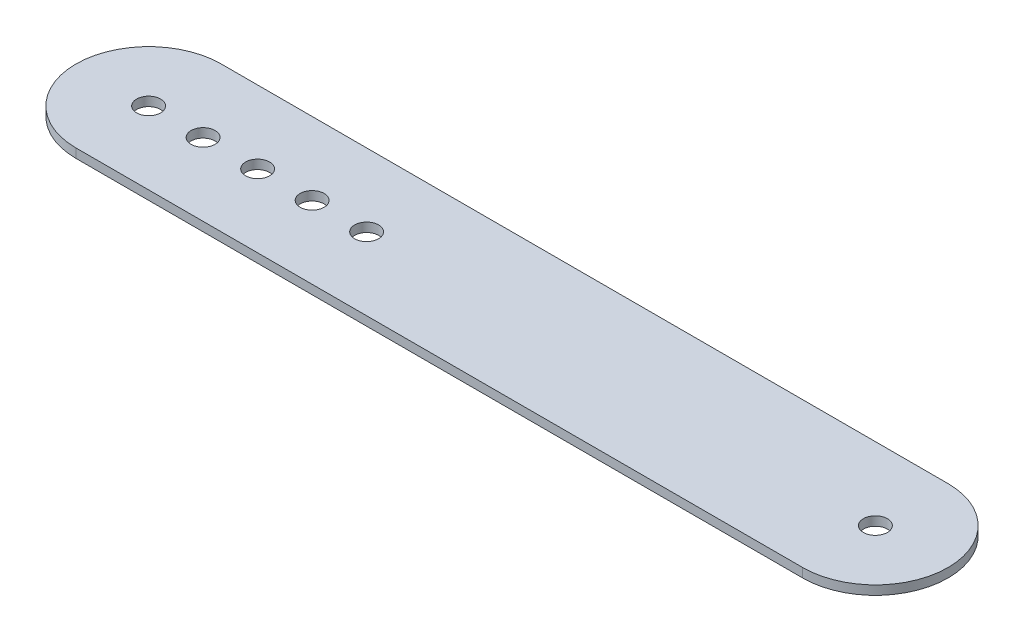
ISO-10303-21;
HEADER;
FILE_DESCRIPTION(('STEP AP214'),'2;1');
FILE_NAME('part.step','',(''),(''),'','','');
FILE_SCHEMA(('AUTOMOTIVE_DESIGN { 1 0 10303 214 1 1 1 1 }'));
ENDSEC;
DATA;
#1=APPLICATION_CONTEXT('core data for automotive mechanical design processes');
#2=APPLICATION_PROTOCOL_DEFINITION('international standard','automotive_design',2000,#1);
#3=PRODUCT_CONTEXT('',#1,'mechanical');
#4=PRODUCT('Part','Part','',(#3));
#5=PRODUCT_RELATED_PRODUCT_CATEGORY('part','',(#4));
#6=PRODUCT_DEFINITION_FORMATION('','',#4);
#7=PRODUCT_DEFINITION_CONTEXT('part definition',#1,'design');
#8=PRODUCT_DEFINITION('design','',#6,#7);
#9=PRODUCT_DEFINITION_SHAPE('','',#8);
#10=(LENGTH_UNIT() NAMED_UNIT(*) SI_UNIT(.MILLI.,.METRE.));
#11=(NAMED_UNIT(*) PLANE_ANGLE_UNIT() SI_UNIT($,.RADIAN.));
#12=(NAMED_UNIT(*) SI_UNIT($,.STERADIAN.) SOLID_ANGLE_UNIT());
#13=UNCERTAINTY_MEASURE_WITH_UNIT(LENGTH_MEASURE(1.E-05),#10,'distance_accuracy_value','');
#14=(GEOMETRIC_REPRESENTATION_CONTEXT(3) GLOBAL_UNCERTAINTY_ASSIGNED_CONTEXT((#13)) GLOBAL_UNIT_ASSIGNED_CONTEXT((#10,
#11,#12)) REPRESENTATION_CONTEXT('',''));
#15=CARTESIAN_POINT('',(0.,0.,0.));
#16=DIRECTION('',(0.,0.,1.));
#17=DIRECTION('',(1.,0.,0.));
#18=AXIS2_PLACEMENT_3D('',#15,#16,#17);
#19=CARTESIAN_POINT('',(-177.8,0.,0.));
#20=DIRECTION('',(0.,1.,0.));
#21=DIRECTION('',(0.,0.,1.));
#22=AXIS2_PLACEMENT_3D('',#19,#20,#21);
#23=CYLINDRICAL_SURFACE('',#22,4.191);
#24=CARTESIAN_POINT('',(-177.8,0.,0.));
#25=DIRECTION('',(0.,1.,0.));
#26=DIRECTION('',(0.,0.,1.));
#27=AXIS2_PLACEMENT_3D('',#24,#25,#26);
#28=CIRCLE('',#27,4.191);
#29=CARTESIAN_POINT('',(-177.8,0.,4.19100000000002));
#30=VERTEX_POINT('',#29);
#31=EDGE_CURVE('E47',#30,#30,#28,.T.);
#32=ORIENTED_EDGE('',*,*,#31,.F.);
#33=EDGE_LOOP('',(#32));
#34=FACE_BOUND('',#33,.T.);
#35=CARTESIAN_POINT('',(-177.8,3.175,0.));
#36=DIRECTION('',(0.,1.,0.));
#37=DIRECTION('',(0.,0.,1.));
#38=AXIS2_PLACEMENT_3D('',#35,#36,#37);
#39=CIRCLE('',#38,4.191);
#40=CARTESIAN_POINT('',(-177.8,3.175,4.19100000000002));
#41=VERTEX_POINT('',#40);
#42=EDGE_CURVE('E11',#41,#41,#39,.T.);
#43=ORIENTED_EDGE('',*,*,#42,.T.);
#44=EDGE_LOOP('',(#43));
#45=FACE_BOUND('',#44,.T.);
#46=ADVANCED_FACE('F38',(#34,#45),#23,.F.);
#47=CARTESIAN_POINT('',(-196.85,0.,0.));
#48=DIRECTION('',(0.,1.,0.));
#49=DIRECTION('',(0.,0.,1.));
#50=AXIS2_PLACEMENT_3D('',#47,#48,#49);
#51=CYLINDRICAL_SURFACE('',#50,4.191);
#52=CARTESIAN_POINT('',(-196.85,0.,0.));
#53=DIRECTION('',(0.,1.,0.));
#54=DIRECTION('',(0.,0.,1.));
#55=AXIS2_PLACEMENT_3D('',#52,#53,#54);
#56=CIRCLE('',#55,4.191);
#57=CARTESIAN_POINT('',(-196.85,0.,4.19100000000002));
#58=VERTEX_POINT('',#57);
#59=EDGE_CURVE('E143',#58,#58,#56,.T.);
#60=ORIENTED_EDGE('',*,*,#59,.F.);
#61=EDGE_LOOP('',(#60));
#62=FACE_BOUND('',#61,.T.);
#63=CARTESIAN_POINT('',(-196.85,3.175,0.));
#64=DIRECTION('',(0.,1.,0.));
#65=DIRECTION('',(0.,0.,1.));
#66=AXIS2_PLACEMENT_3D('',#63,#64,#65);
#67=CIRCLE('',#66,4.191);
#68=CARTESIAN_POINT('',(-196.85,3.175,4.19100000000002));
#69=VERTEX_POINT('',#68);
#70=EDGE_CURVE('E147',#69,#69,#67,.T.);
#71=ORIENTED_EDGE('',*,*,#70,.T.);
#72=EDGE_LOOP('',(#71));
#73=FACE_BOUND('',#72,.T.);
#74=ADVANCED_FACE('F159',(#62,#73),#51,.F.);
#75=CARTESIAN_POINT('',(-215.9,0.,0.));
#76=DIRECTION('',(0.,1.,0.));
#77=DIRECTION('',(0.,0.,1.));
#78=AXIS2_PLACEMENT_3D('',#75,#76,#77);
#79=CYLINDRICAL_SURFACE('',#78,4.191);
#80=CARTESIAN_POINT('',(-215.9,0.,0.));
#81=DIRECTION('',(0.,1.,0.));
#82=DIRECTION('',(0.,0.,1.));
#83=AXIS2_PLACEMENT_3D('',#80,#81,#82);
#84=CIRCLE('',#83,4.191);
#85=CARTESIAN_POINT('',(-215.9,0.,4.19100000000003));
#86=VERTEX_POINT('',#85);
#87=EDGE_CURVE('E135',#86,#86,#84,.T.);
#88=ORIENTED_EDGE('',*,*,#87,.F.);
#89=EDGE_LOOP('',(#88));
#90=FACE_BOUND('',#89,.T.);
#91=CARTESIAN_POINT('',(-215.9,3.175,0.));
#92=DIRECTION('',(0.,1.,0.));
#93=DIRECTION('',(0.,0.,1.));
#94=AXIS2_PLACEMENT_3D('',#91,#92,#93);
#95=CIRCLE('',#94,4.191);
#96=CARTESIAN_POINT('',(-215.9,3.175,4.19100000000003));
#97=VERTEX_POINT('',#96);
#98=EDGE_CURVE('E139',#97,#97,#95,.T.);
#99=ORIENTED_EDGE('',*,*,#98,.T.);
#100=EDGE_LOOP('',(#99));
#101=FACE_BOUND('',#100,.T.);
#102=ADVANCED_FACE('F223',(#90,#101),#79,.F.);
#103=CARTESIAN_POINT('',(-234.95,0.,0.));
#104=DIRECTION('',(0.,1.,0.));
#105=DIRECTION('',(0.,0.,1.));
#106=AXIS2_PLACEMENT_3D('',#103,#104,#105);
#107=CYLINDRICAL_SURFACE('',#106,4.191);
#108=CARTESIAN_POINT('',(-234.95,0.,0.));
#109=DIRECTION('',(0.,1.,0.));
#110=DIRECTION('',(0.,0.,1.));
#111=AXIS2_PLACEMENT_3D('',#108,#109,#110);
#112=CIRCLE('',#111,4.191);
#113=CARTESIAN_POINT('',(-234.95,0.,4.19100000000003));
#114=VERTEX_POINT('',#113);
#115=EDGE_CURVE('E127',#114,#114,#112,.T.);
#116=ORIENTED_EDGE('',*,*,#115,.F.);
#117=EDGE_LOOP('',(#116));
#118=FACE_BOUND('',#117,.T.);
#119=CARTESIAN_POINT('',(-234.95,3.175,0.));
#120=DIRECTION('',(0.,1.,0.));
#121=DIRECTION('',(0.,0.,1.));
#122=AXIS2_PLACEMENT_3D('',#119,#120,#121);
#123=CIRCLE('',#122,4.191);
#124=CARTESIAN_POINT('',(-234.95,3.175,4.19100000000003));
#125=VERTEX_POINT('',#124);
#126=EDGE_CURVE('E131',#125,#125,#123,.T.);
#127=ORIENTED_EDGE('',*,*,#126,.T.);
#128=EDGE_LOOP('',(#127));
#129=FACE_BOUND('',#128,.T.);
#130=ADVANCED_FACE('F219',(#118,#129),#107,.F.);
#131=CARTESIAN_POINT('',(0.,3.175,0.));
#132=DIRECTION('',(0.,-1.,0.));
#133=DIRECTION('',(0.,0.,-1.));
#134=AXIS2_PLACEMENT_3D('',#131,#132,#133);
#135=CYLINDRICAL_SURFACE('',#134,25.4);
#136=CARTESIAN_POINT('',(0.,0.,0.));
#137=DIRECTION('',(0.,1.,0.));
#138=DIRECTION('',(0.,0.,1.));
#139=AXIS2_PLACEMENT_3D('',#136,#137,#138);
#140=CIRCLE('',#139,25.4);
#141=CARTESIAN_POINT('',(0.,0.,25.4));
#142=VERTEX_POINT('',#141);
#143=CARTESIAN_POINT('',(0.,0.,-25.4));
#144=VERTEX_POINT('',#143);
#145=EDGE_CURVE('E110',#142,#144,#140,.T.);
#146=ORIENTED_EDGE('',*,*,#145,.T.);
#147=DIRECTION('',(0.,-1.,0.));
#148=VECTOR('',#147,1.);
#149=CARTESIAN_POINT('',(0.,3.175,-25.4));
#150=LINE('',#149,#148);
#151=CARTESIAN_POINT('',(0.,3.175,-25.4));
#152=VERTEX_POINT('',#151);
#153=EDGE_CURVE('E99',#152,#144,#150,.T.);
#154=ORIENTED_EDGE('',*,*,#153,.F.);
#155=CARTESIAN_POINT('',(0.,3.175,0.));
#156=DIRECTION('',(0.,1.,0.));
#157=DIRECTION('',(0.,0.,1.));
#158=AXIS2_PLACEMENT_3D('',#155,#156,#157);
#159=CIRCLE('',#158,25.4);
#160=CARTESIAN_POINT('',(0.,3.175,25.4));
#161=VERTEX_POINT('',#160);
#162=EDGE_CURVE('E91',#161,#152,#159,.T.);
#163=ORIENTED_EDGE('',*,*,#162,.F.);
#164=DIRECTION('',(0.,-1.,0.));
#165=VECTOR('',#164,1.);
#166=CARTESIAN_POINT('',(0.,3.175,25.4));
#167=LINE('',#166,#165);
#168=EDGE_CURVE('E106',#161,#142,#167,.T.);
#169=ORIENTED_EDGE('',*,*,#168,.T.);
#170=EDGE_LOOP('',(#146,#154,#163,#169));
#171=FACE_BOUND('',#170,.T.);
#172=ADVANCED_FACE('F216',(#171),#135,.T.);
#173=CARTESIAN_POINT('',(0.,3.175,-25.4));
#174=DIRECTION('',(0.,0.,1.));
#175=DIRECTION('',(1.,0.,0.));
#176=AXIS2_PLACEMENT_3D('',#173,#174,#175);
#177=PLANE('',#176);
#178=DIRECTION('',(-1.,0.,0.));
#179=VECTOR('',#178,1.);
#180=CARTESIAN_POINT('',(0.,0.,-25.4));
#181=LINE('',#180,#179);
#182=CARTESIAN_POINT('',(-254.,0.,-25.4));
#183=VERTEX_POINT('',#182);
#184=EDGE_CURVE('E97',#144,#183,#181,.T.);
#185=ORIENTED_EDGE('',*,*,#184,.T.);
#186=DIRECTION('',(0.,-1.,0.));
#187=VECTOR('',#186,1.);
#188=CARTESIAN_POINT('',(-254.,3.175,-25.4));
#189=LINE('',#188,#187);
#190=CARTESIAN_POINT('',(-254.,3.175,-25.4));
#191=VERTEX_POINT('',#190);
#192=EDGE_CURVE('E95',#191,#183,#189,.T.);
#193=ORIENTED_EDGE('',*,*,#192,.F.);
#194=DIRECTION('',(-1.,0.,0.));
#195=VECTOR('',#194,1.);
#196=CARTESIAN_POINT('',(0.,3.175,-25.4));
#197=LINE('',#196,#195);
#198=EDGE_CURVE('E86',#152,#191,#197,.T.);
#199=ORIENTED_EDGE('',*,*,#198,.F.);
#200=ORIENTED_EDGE('',*,*,#153,.T.);
#201=EDGE_LOOP('',(#185,#193,#199,#200));
#202=FACE_BOUND('',#201,.T.);
#203=ADVANCED_FACE('F96',(#202),#177,.F.);
#204=CARTESIAN_POINT('',(-254.,3.175,0.));
#205=DIRECTION('',(0.,-1.,0.));
#206=DIRECTION('',(0.,0.,-1.));
#207=AXIS2_PLACEMENT_3D('',#204,#205,#206);
#208=CYLINDRICAL_SURFACE('',#207,25.4);
#209=CARTESIAN_POINT('',(-254.,0.,0.));
#210=DIRECTION('',(0.,1.,0.));
#211=DIRECTION('',(0.,0.,1.));
#212=AXIS2_PLACEMENT_3D('',#209,#210,#211);
#213=CIRCLE('',#212,25.4);
#214=CARTESIAN_POINT('',(-254.,0.,25.4));
#215=VERTEX_POINT('',#214);
#216=EDGE_CURVE('E72',#183,#215,#213,.T.);
#217=ORIENTED_EDGE('',*,*,#216,.T.);
#218=DIRECTION('',(0.,-1.,0.));
#219=VECTOR('',#218,1.);
#220=CARTESIAN_POINT('',(-254.,3.175,25.4));
#221=LINE('',#220,#219);
#222=CARTESIAN_POINT('',(-254.,3.175,25.4));
#223=VERTEX_POINT('',#222);
#224=EDGE_CURVE('E100',#223,#215,#221,.T.);
#225=ORIENTED_EDGE('',*,*,#224,.F.);
#226=CARTESIAN_POINT('',(-254.,3.175,0.));
#227=DIRECTION('',(0.,1.,0.));
#228=DIRECTION('',(0.,0.,1.));
#229=AXIS2_PLACEMENT_3D('',#226,#227,#228);
#230=CIRCLE('',#229,25.4);
#231=EDGE_CURVE('E89',#191,#223,#230,.T.);
#232=ORIENTED_EDGE('',*,*,#231,.F.);
#233=ORIENTED_EDGE('',*,*,#192,.T.);
#234=EDGE_LOOP('',(#217,#225,#232,#233));
#235=FACE_BOUND('',#234,.T.);
#236=ADVANCED_FACE('F102',(#235),#208,.T.);
#237=CARTESIAN_POINT('',(0.,3.175,25.4));
#238=DIRECTION('',(0.,0.,-1.));
#239=DIRECTION('',(-1.,0.,0.));
#240=AXIS2_PLACEMENT_3D('',#237,#238,#239);
#241=PLANE('',#240);
#242=DIRECTION('',(1.,0.,0.));
#243=VECTOR('',#242,1.);
#244=CARTESIAN_POINT('',(0.,0.,25.4));
#245=LINE('',#244,#243);
#246=EDGE_CURVE('E78',#215,#142,#245,.T.);
#247=ORIENTED_EDGE('',*,*,#246,.T.);
#248=ORIENTED_EDGE('',*,*,#168,.F.);
#249=DIRECTION('',(1.,0.,0.));
#250=VECTOR('',#249,1.);
#251=CARTESIAN_POINT('',(0.,3.175,25.4));
#252=LINE('',#251,#250);
#253=EDGE_CURVE('E55',#223,#161,#252,.T.);
#254=ORIENTED_EDGE('',*,*,#253,.F.);
#255=ORIENTED_EDGE('',*,*,#224,.T.);
#256=EDGE_LOOP('',(#247,#248,#254,#255));
#257=FACE_BOUND('',#256,.T.);
#258=ADVANCED_FACE('F164',(#257),#241,.F.);
#259=CARTESIAN_POINT('',(0.,3.175,0.));
#260=DIRECTION('',(0.,1.,0.));
#261=DIRECTION('',(0.,0.,1.));
#262=AXIS2_PLACEMENT_3D('',#259,#260,#261);
#263=PLANE('',#262);
#264=ORIENTED_EDGE('',*,*,#42,.F.);
#265=EDGE_LOOP('',(#264));
#266=FACE_BOUND('',#265,.T.);
#267=ORIENTED_EDGE('',*,*,#70,.F.);
#268=EDGE_LOOP('',(#267));
#269=FACE_BOUND('',#268,.T.);
#270=ORIENTED_EDGE('',*,*,#98,.F.);
#271=EDGE_LOOP('',(#270));
#272=FACE_BOUND('',#271,.T.);
#273=ORIENTED_EDGE('',*,*,#126,.F.);
#274=EDGE_LOOP('',(#273));
#275=FACE_BOUND('',#274,.T.);
#276=CARTESIAN_POINT('',(0.,3.175,0.));
#277=DIRECTION('',(0.,1.,0.));
#278=DIRECTION('',(0.,0.,1.));
#279=AXIS2_PLACEMENT_3D('',#276,#277,#278);
#280=CIRCLE('',#279,4.191);
#281=CARTESIAN_POINT('',(0.,3.175,4.191));
#282=VERTEX_POINT('',#281);
#283=EDGE_CURVE('E175',#282,#282,#280,.T.);
#284=ORIENTED_EDGE('',*,*,#283,.F.);
#285=EDGE_LOOP('',(#284));
#286=FACE_BOUND('',#285,.T.);
#287=CARTESIAN_POINT('',(-254.,3.175,0.));
#288=DIRECTION('',(0.,1.,0.));
#289=DIRECTION('',(0.,0.,1.));
#290=AXIS2_PLACEMENT_3D('',#287,#288,#289);
#291=CIRCLE('',#290,4.191);
#292=CARTESIAN_POINT('',(-254.,3.175,4.19100000000003));
#293=VERTEX_POINT('',#292);
#294=EDGE_CURVE('E178',#293,#293,#291,.T.);
#295=ORIENTED_EDGE('',*,*,#294,.F.);
#296=EDGE_LOOP('',(#295));
#297=FACE_BOUND('',#296,.T.);
#298=ORIENTED_EDGE('',*,*,#162,.T.);
#299=ORIENTED_EDGE('',*,*,#198,.T.);
#300=ORIENTED_EDGE('',*,*,#231,.T.);
#301=ORIENTED_EDGE('',*,*,#253,.T.);
#302=EDGE_LOOP('',(#298,#299,#300,#301));
#303=FACE_BOUND('',#302,.T.);
#304=ADVANCED_FACE('F87',(#266,#269,#272,#275,#286,#297,#303),#263,.T.);
#305=CARTESIAN_POINT('',(0.,0.,0.));
#306=DIRECTION('',(0.,1.,0.));
#307=DIRECTION('',(0.,0.,1.));
#308=AXIS2_PLACEMENT_3D('',#305,#306,#307);
#309=PLANE('',#308);
#310=ORIENTED_EDGE('',*,*,#31,.T.);
#311=EDGE_LOOP('',(#310));
#312=FACE_BOUND('',#311,.T.);
#313=ORIENTED_EDGE('',*,*,#59,.T.);
#314=EDGE_LOOP('',(#313));
#315=FACE_BOUND('',#314,.T.);
#316=ORIENTED_EDGE('',*,*,#87,.T.);
#317=EDGE_LOOP('',(#316));
#318=FACE_BOUND('',#317,.T.);
#319=ORIENTED_EDGE('',*,*,#115,.T.);
#320=EDGE_LOOP('',(#319));
#321=FACE_BOUND('',#320,.T.);
#322=CARTESIAN_POINT('',(0.,0.,0.));
#323=DIRECTION('',(0.,1.,0.));
#324=DIRECTION('',(0.,0.,1.));
#325=AXIS2_PLACEMENT_3D('',#322,#323,#324);
#326=CIRCLE('',#325,4.191);
#327=CARTESIAN_POINT('',(0.,0.,4.191));
#328=VERTEX_POINT('',#327);
#329=EDGE_CURVE('E114',#328,#328,#326,.T.);
#330=ORIENTED_EDGE('',*,*,#329,.T.);
#331=EDGE_LOOP('',(#330));
#332=FACE_BOUND('',#331,.T.);
#333=CARTESIAN_POINT('',(-254.,0.,0.));
#334=DIRECTION('',(0.,1.,0.));
#335=DIRECTION('',(0.,0.,1.));
#336=AXIS2_PLACEMENT_3D('',#333,#334,#335);
#337=CIRCLE('',#336,4.191);
#338=CARTESIAN_POINT('',(-254.,0.,4.19100000000003));
#339=VERTEX_POINT('',#338);
#340=EDGE_CURVE('E181',#339,#339,#337,.T.);
#341=ORIENTED_EDGE('',*,*,#340,.T.);
#342=EDGE_LOOP('',(#341));
#343=FACE_BOUND('',#342,.T.);
#344=ORIENTED_EDGE('',*,*,#145,.F.);
#345=ORIENTED_EDGE('',*,*,#246,.F.);
#346=ORIENTED_EDGE('',*,*,#216,.F.);
#347=ORIENTED_EDGE('',*,*,#184,.F.);
#348=EDGE_LOOP('',(#344,#345,#346,#347));
#349=FACE_BOUND('',#348,.T.);
#350=ADVANCED_FACE('F154',(#312,#315,#318,#321,#332,#343,#349),#309,.F.);
#351=CARTESIAN_POINT('',(-254.,0.,0.));
#352=DIRECTION('',(0.,1.,0.));
#353=DIRECTION('',(0.,0.,1.));
#354=AXIS2_PLACEMENT_3D('',#351,#352,#353);
#355=CYLINDRICAL_SURFACE('',#354,4.191);
#356=ORIENTED_EDGE('',*,*,#340,.F.);
#357=EDGE_LOOP('',(#356));
#358=FACE_BOUND('',#357,.T.);
#359=ORIENTED_EDGE('',*,*,#294,.T.);
#360=EDGE_LOOP('',(#359));
#361=FACE_BOUND('',#360,.T.);
#362=ADVANCED_FACE('F199',(#358,#361),#355,.F.);
#363=CARTESIAN_POINT('',(0.,0.,0.));
#364=DIRECTION('',(0.,1.,0.));
#365=DIRECTION('',(0.,0.,1.));
#366=AXIS2_PLACEMENT_3D('',#363,#364,#365);
#367=CYLINDRICAL_SURFACE('',#366,4.191);
#368=ORIENTED_EDGE('',*,*,#329,.F.);
#369=EDGE_LOOP('',(#368));
#370=FACE_BOUND('',#369,.T.);
#371=ORIENTED_EDGE('',*,*,#283,.T.);
#372=EDGE_LOOP('',(#371));
#373=FACE_BOUND('',#372,.T.);
#374=ADVANCED_FACE('F196',(#370,#373),#367,.F.);
#375=CLOSED_SHELL('',(#46,#74,#102,#130,#172,#203,#236,#258,#304,#350,#362,#374));
#376=MANIFOLD_SOLID_BREP('B2',#375);
#377=ADVANCED_BREP_SHAPE_REPRESENTATION('',(#18,#376),#14);
#378=SHAPE_DEFINITION_REPRESENTATION(#9,#377);
ENDSEC;
END-ISO-10303-21;
